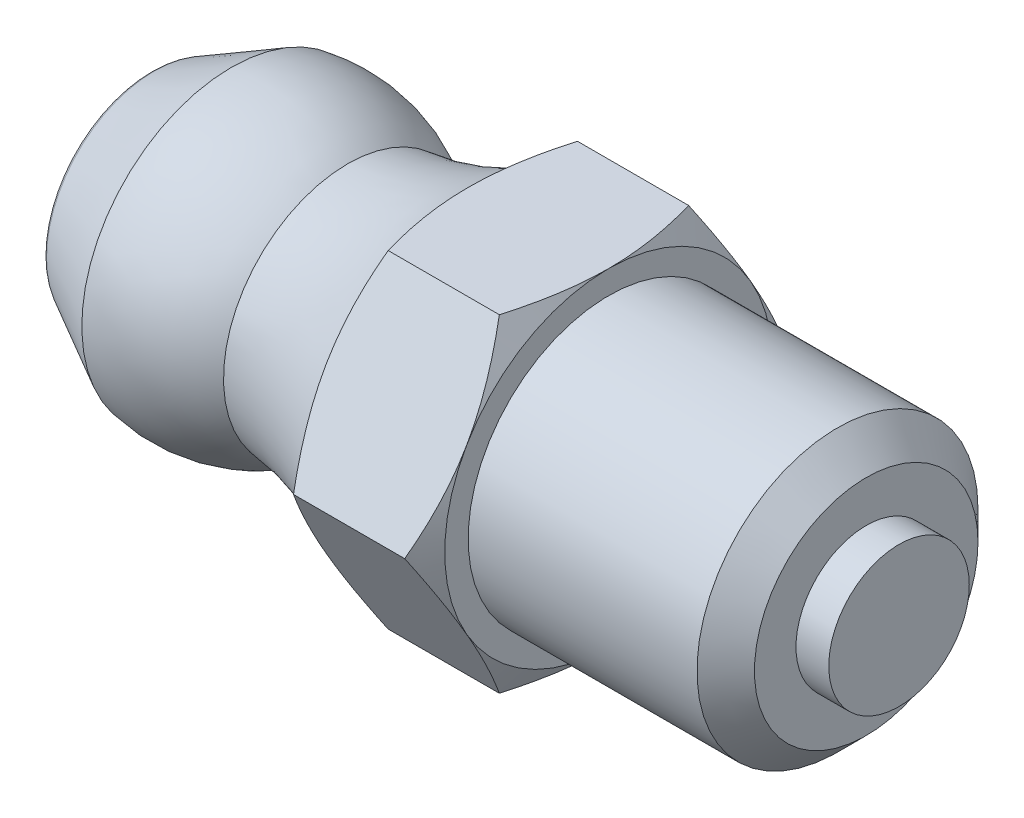
ISO-10303-21;
HEADER;
FILE_DESCRIPTION(('STEP AP214'),'2;1');
FILE_NAME('part.step','',(''),(''),'','','');
FILE_SCHEMA(('AUTOMOTIVE_DESIGN { 1 0 10303 214 1 1 1 1 }'));
ENDSEC;
DATA;
#1=APPLICATION_CONTEXT('core data for automotive mechanical design processes');
#2=APPLICATION_PROTOCOL_DEFINITION('international standard','automotive_design',2000,#1);
#3=PRODUCT_CONTEXT('',#1,'mechanical');
#4=PRODUCT('Part','Part','',(#3));
#5=PRODUCT_RELATED_PRODUCT_CATEGORY('part','',(#4));
#6=PRODUCT_DEFINITION_FORMATION('','',#4);
#7=PRODUCT_DEFINITION_CONTEXT('part definition',#1,'design');
#8=PRODUCT_DEFINITION('design','',#6,#7);
#9=PRODUCT_DEFINITION_SHAPE('','',#8);
#10=(LENGTH_UNIT() NAMED_UNIT(*) SI_UNIT(.MILLI.,.METRE.));
#11=(NAMED_UNIT(*) PLANE_ANGLE_UNIT() SI_UNIT($,.RADIAN.));
#12=(NAMED_UNIT(*) SI_UNIT($,.STERADIAN.) SOLID_ANGLE_UNIT());
#13=UNCERTAINTY_MEASURE_WITH_UNIT(LENGTH_MEASURE(1.E-05),#10,'distance_accuracy_value','');
#14=(GEOMETRIC_REPRESENTATION_CONTEXT(3) GLOBAL_UNCERTAINTY_ASSIGNED_CONTEXT((#13)) GLOBAL_UNIT_ASSIGNED_CONTEXT((#10,
#11,#12)) REPRESENTATION_CONTEXT('',''));
#15=CARTESIAN_POINT('',(0.,0.,0.));
#16=DIRECTION('',(0.,0.,1.));
#17=DIRECTION('',(1.,0.,0.));
#18=AXIS2_PLACEMENT_3D('',#15,#16,#17);
#19=CARTESIAN_POINT('',(-2.68551696456143,0.,0.));
#20=DIRECTION('',(1.,0.,0.));
#21=DIRECTION('',(0.,0.,-1.));
#22=AXIS2_PLACEMENT_3D('',#19,#20,#21);
#23=CONICAL_SURFACE('',#22,4.04470059544337,1.04719755120523);
#24=CARTESIAN_POINT('',(-2.6873926088047,9.33987770145344E-12,-4.04145188432874));
#25=CARTESIAN_POINT('',(-2.73528350417485,0.143657647443275,-3.95851110290731));
#26=CARTESIAN_POINT('',(-2.77912897165721,0.288451754037613,-3.87491418648621));
#27=CARTESIAN_POINT('',(-2.85662039631276,0.580392046978202,-3.70636237976833));
#28=CARTESIAN_POINT('',(-2.89024353270487,0.727542735051402,-3.6214048903983));
#29=CARTESIAN_POINT('',(-2.9443136056338,1.0201929490846,-3.45244321054822));
#30=CARTESIAN_POINT('',(-2.96504882119068,1.16565127222401,-3.36846280852777));
#31=CARTESIAN_POINT('',(-2.99288461839885,1.45740711983151,-3.20001749137364));
#32=CARTESIAN_POINT('',(-2.99999999996195,1.60370355991562,-3.11555320230935));
#33=CARTESIAN_POINT('',(-2.99999999996197,1.89629644008413,-2.94662462418112));
#34=CARTESIAN_POINT('',(-2.99288461839886,2.04259288016852,-2.86216033511718));
#35=CARTESIAN_POINT('',(-2.96504882119062,2.33434872777635,-2.69371501796334));
#36=CARTESIAN_POINT('',(-2.94431360563366,2.47980705091579,-2.60973461594284));
#37=CARTESIAN_POINT('',(-2.89024353270487,2.77245726494896,-2.44077293609234));
#38=CARTESIAN_POINT('',(-2.85662039631298,2.91960795302209,-2.35581544672189));
#39=CARTESIAN_POINT('',(-2.77912897165668,3.21154824596325,-2.18726364000504));
#40=CARTESIAN_POINT('',(-2.73528350417334,3.35634235255824,-2.10366672358537));
#41=CARTESIAN_POINT('',(-2.68739260880087,3.49999999999358,-2.02072594216739));
#42=B_SPLINE_CURVE_WITH_KNOTS('',3,(#24,#25,#26,#27,#28,#29,#30,#31,#32,#33,#34,#35,#36,#37,#38,
#39,#40,#41),.UNSPECIFIED.,.F.,.F.,(4,2,2,2,2,2,2,2,4),(0.,0.518128442797922,1.03740522553155,
1.5446040034222,2.05125132319115,2.55789864296032,3.06509742085119,3.58437420358504,
4.10250264638326),.UNSPECIFIED.);
#43=CARTESIAN_POINT('',(-2.99999999996214,1.75,-3.03108891324554));
#44=VERTEX_POINT('',#43);
#45=CARTESIAN_POINT('',(-2.68739260880116,3.49999999999635,-2.02072594216158));
#46=VERTEX_POINT('',#45);
#47=EDGE_CURVE('E179',#44,#46,#42,.T.);
#48=ORIENTED_EDGE('',*,*,#47,.F.);
#49=CARTESIAN_POINT('',(-2.9999999999859,0.,0.));
#50=DIRECTION('',(1.,0.,0.));
#51=DIRECTION('',(0.,0.,1.));
#52=AXIS2_PLACEMENT_3D('',#49,#50,#51);
#53=CIRCLE('',#52,3.49999999997408);
#54=CARTESIAN_POINT('',(-2.9999999999859,3.5,0.));
#55=VERTEX_POINT('',#54);
#56=EDGE_CURVE('E67',#44,#55,#53,.T.);
#57=ORIENTED_EDGE('',*,*,#56,.T.);
#58=CARTESIAN_POINT('',(-2.6873926088047,3.50000000000585,-2.02072594215628));
#59=CARTESIAN_POINT('',(-2.73528350417485,3.50000000000212,-1.85484437931987));
#60=CARTESIAN_POINT('',(-2.77912897165721,3.50000000000058,-1.68765054648035));
#61=CARTESIAN_POINT('',(-2.85662039631276,3.49999999999942,-1.35054693304659));
#62=CARTESIAN_POINT('',(-2.89024353270487,3.49999999999983,-1.18063195430582));
#63=CARTESIAN_POINT('',(-2.9443136056338,3.50000000000017,-0.842708594605082));
#64=CARTESIAN_POINT('',(-2.96504882119068,3.50000000000012,-0.674747790564246));
#65=CARTESIAN_POINT('',(-2.99288461839885,3.49999999999987,-0.337857156256419));
#66=CARTESIAN_POINT('',(-2.99999999996195,3.49999999999967,-0.168928578128211));
#67=CARTESIAN_POINT('',(-2.99999999996197,3.49999999999969,0.168928578128286));
#68=CARTESIAN_POINT('',(-2.99288461839886,3.49999999999992,0.337857156256575));
#69=CARTESIAN_POINT('',(-2.96504882119063,3.50000000000008,0.674747790564535));
#70=CARTESIAN_POINT('',(-2.94431360563366,3.50000000000002,0.842708594605422));
#71=CARTESIAN_POINT('',(-2.89024353270487,3.49999999999997,1.18063195430636));
#72=CARTESIAN_POINT('',(-2.85662039631299,3.49999999999999,1.35054693304726));
#73=CARTESIAN_POINT('',(-2.77912897165668,3.50000000000001,1.68765054648101));
#74=CARTESIAN_POINT('',(-2.73528350417335,3.50000000000002,1.85484437932038));
#75=CARTESIAN_POINT('',(-2.68739260880087,3.5,2.02072594215628));
#76=B_SPLINE_CURVE_WITH_KNOTS('',3,(#58,#59,#60,#61,#62,#63,#64,#65,#66,#67,#68,#69,#70,#71,#72,
#73,#74,#75),.UNSPECIFIED.,.F.,.F.,(4,2,2,2,2,2,2,2,4),(0.,0.518128442797922,1.03740522553155,
1.5446040034222,2.05125132319115,2.55789864296032,3.06509742085119,3.58437420358504,
4.10250264638326),.UNSPECIFIED.);
#77=EDGE_CURVE('E141',#46,#55,#76,.T.);
#78=ORIENTED_EDGE('',*,*,#77,.F.);
#79=EDGE_LOOP('',(#48,#57,#78));
#80=FACE_BOUND('',#79,.T.);
#81=ADVANCED_FACE('F52',(#80),#23,.T.);
#82=CARTESIAN_POINT('',(-2.68739260879995,3.49999999999635,2.0207259421658));
#83=VERTEX_POINT('',#82);
#84=EDGE_CURVE('E132',#55,#83,#76,.T.);
#85=ORIENTED_EDGE('',*,*,#84,.F.);
#86=CARTESIAN_POINT('',(-2.9999999999859,1.75,3.03108891324554));
#87=VERTEX_POINT('',#86);
#88=EDGE_CURVE('E150',#55,#87,#53,.T.);
#89=ORIENTED_EDGE('',*,*,#88,.T.);
#90=CARTESIAN_POINT('',(-2.6873926088047,3.49999999999651,2.02072594217246));
#91=CARTESIAN_POINT('',(-2.73528350417485,3.35634235255885,2.10366672358744));
#92=CARTESIAN_POINT('',(-2.77912897165721,3.21154824596296,2.18726364000586));
#93=CARTESIAN_POINT('',(-2.85662039631276,2.91960795302122,2.35581544672174));
#94=CARTESIAN_POINT('',(-2.89024353270487,2.77245726494843,2.44077293609247));
#95=CARTESIAN_POINT('',(-2.9443136056338,2.47980705091557,2.60973461594314));
#96=CARTESIAN_POINT('',(-2.96504882119068,2.33434872777612,2.69371501796352));
#97=CARTESIAN_POINT('',(-2.99288461839885,2.04259288016837,2.86216033511722));
#98=CARTESIAN_POINT('',(-2.99999999996195,1.89629644008405,2.94662462418114));
#99=CARTESIAN_POINT('',(-2.99999999996197,1.60370355991557,3.11555320230941));
#100=CARTESIAN_POINT('',(-2.99288461839887,1.4574071198314,3.20001749137375));
#101=CARTESIAN_POINT('',(-2.96504882119063,1.16565127222373,3.36846280852787));
#102=CARTESIAN_POINT('',(-2.94431360563366,1.02019294908423,3.45244321054826));
#103=CARTESIAN_POINT('',(-2.89024353270487,0.727542735051013,3.62140489039869));
#104=CARTESIAN_POINT('',(-2.85662039631299,0.580392046977899,3.70636237976915));
#105=CARTESIAN_POINT('',(-2.77912897165668,0.288451754036758,3.87491418648605));
#106=CARTESIAN_POINT('',(-2.73528350417335,0.143657647441784,3.95851110290574));
#107=CARTESIAN_POINT('',(-2.68739260880087,6.41288661933034E-12,4.04145188432367));
#108=B_SPLINE_CURVE_WITH_KNOTS('',3,(#90,#91,#92,#93,#94,#95,#96,#97,#98,#99,#100,#101,#102,
#103,#104,#105,#106,#107),.UNSPECIFIED.,.F.,.F.,(4,2,2,2,2,2,2,2,4),(0.,0.518128442797922,
1.03740522553154,1.5446040034222,2.05125132319114,2.55789864296031,3.06509742085119,
3.58437420358504,4.10250264638326),.UNSPECIFIED.);
#109=EDGE_CURVE('E148',#83,#87,#108,.T.);
#110=ORIENTED_EDGE('',*,*,#109,.F.);
#111=EDGE_LOOP('',(#85,#89,#110));
#112=FACE_BOUND('',#111,.T.);
#113=ADVANCED_FACE('F149',(#112),#23,.T.);
#114=CARTESIAN_POINT('',(-2.68739260880116,0.,4.04145188432316));
#115=VERTEX_POINT('',#114);
#116=EDGE_CURVE('E155',#87,#115,#108,.T.);
#117=ORIENTED_EDGE('',*,*,#116,.F.);
#118=CARTESIAN_POINT('',(-2.9999999999859,-1.75,3.03108891324554));
#119=VERTEX_POINT('',#118);
#120=EDGE_CURVE('E574',#87,#119,#53,.T.);
#121=ORIENTED_EDGE('',*,*,#120,.T.);
#122=CARTESIAN_POINT('',(-2.6873926088047,-9.34046040191118E-12,4.04145188432874));
#123=CARTESIAN_POINT('',(-2.73528350417485,-0.143657647443276,3.95851110290731));
#124=CARTESIAN_POINT('',(-2.77912897165721,-0.288451754037614,3.87491418648621));
#125=CARTESIAN_POINT('',(-2.85662039631276,-0.580392046978203,3.70636237976833));
#126=CARTESIAN_POINT('',(-2.89024353270487,-0.727542735051402,3.6214048903983));
#127=CARTESIAN_POINT('',(-2.9443136056338,-1.02019294908461,3.45244321054822));
#128=CARTESIAN_POINT('',(-2.96504882119068,-1.16565127222401,3.36846280852777));
#129=CARTESIAN_POINT('',(-2.99288461839884,-1.45740711983151,3.20001749137364));
#130=CARTESIAN_POINT('',(-2.99999999996195,-1.60370355991562,3.11555320230936));
#131=CARTESIAN_POINT('',(-2.99999999996197,-1.89629644008413,2.94662462418112));
#132=CARTESIAN_POINT('',(-2.99288461839886,-2.04259288016852,2.86216033511718));
#133=CARTESIAN_POINT('',(-2.96504882119062,-2.33434872777635,2.69371501796334));
#134=CARTESIAN_POINT('',(-2.94431360563366,-2.47980705091579,2.60973461594284));
#135=CARTESIAN_POINT('',(-2.89024353270487,-2.77245726494896,2.44077293609234));
#136=CARTESIAN_POINT('',(-2.85662039631298,-2.91960795302209,2.35581544672189));
#137=CARTESIAN_POINT('',(-2.77912897165668,-3.21154824596325,2.18726364000504));
#138=CARTESIAN_POINT('',(-2.73528350417334,-3.35634235255824,2.10366672358537));
#139=CARTESIAN_POINT('',(-2.68739260880087,-3.49999999999359,2.0207259421674));
#140=B_SPLINE_CURVE_WITH_KNOTS('',3,(#122,#123,#124,#125,#126,#127,#128,#129,#130,#131,#132,
#133,#134,#135,#136,#137,#138,#139),.UNSPECIFIED.,.F.,.F.,(4,2,2,2,2,2,2,2,4),(0.,
0.518128442797922,1.03740522553155,1.5446040034222,2.05125132319115,2.55789864296032,
3.06509742085119,3.58437420358504,4.10250264638325),.UNSPECIFIED.);
#141=EDGE_CURVE('E192',#115,#119,#140,.T.);
#142=ORIENTED_EDGE('',*,*,#141,.F.);
#143=EDGE_LOOP('',(#117,#121,#142));
#144=FACE_BOUND('',#143,.T.);
#145=ADVANCED_FACE('F602',(#144),#23,.T.);
#146=CARTESIAN_POINT('',(-2.68739260880116,-3.49999999999635,2.02072594216158));
#147=VERTEX_POINT('',#146);
#148=EDGE_CURVE('E196',#119,#147,#140,.T.);
#149=ORIENTED_EDGE('',*,*,#148,.F.);
#150=CARTESIAN_POINT('',(-2.9999999999859,-3.5,0.));
#151=VERTEX_POINT('',#150);
#152=EDGE_CURVE('E575',#119,#151,#53,.T.);
#153=ORIENTED_EDGE('',*,*,#152,.T.);
#154=CARTESIAN_POINT('',(-2.6873926088047,-3.50000000000585,2.02072594215628));
#155=CARTESIAN_POINT('',(-2.73528350417485,-3.50000000000212,1.85484437931987));
#156=CARTESIAN_POINT('',(-2.77912897165721,-3.50000000000058,1.68765054648035));
#157=CARTESIAN_POINT('',(-2.85662039631276,-3.49999999999942,1.35054693304659));
#158=CARTESIAN_POINT('',(-2.89024353270487,-3.49999999999983,1.18063195430582));
#159=CARTESIAN_POINT('',(-2.9443136056338,-3.50000000000017,0.842708594605082));
#160=CARTESIAN_POINT('',(-2.96504882119068,-3.50000000000013,0.674747790564246));
#161=CARTESIAN_POINT('',(-2.99288461839885,-3.49999999999987,0.337857156256419));
#162=CARTESIAN_POINT('',(-2.99999999996195,-3.49999999999967,0.168928578128211));
#163=CARTESIAN_POINT('',(-2.99999999996197,-3.49999999999969,-0.168928578128286));
#164=CARTESIAN_POINT('',(-2.99288461839886,-3.49999999999992,-0.337857156256575));
#165=CARTESIAN_POINT('',(-2.96504882119063,-3.50000000000008,-0.674747790564535));
#166=CARTESIAN_POINT('',(-2.94431360563366,-3.50000000000002,-0.842708594605422));
#167=CARTESIAN_POINT('',(-2.89024353270487,-3.49999999999998,-1.18063195430636));
#168=CARTESIAN_POINT('',(-2.85662039631299,-3.49999999999999,-1.35054693304726));
#169=CARTESIAN_POINT('',(-2.77912897165668,-3.50000000000001,-1.68765054648101));
#170=CARTESIAN_POINT('',(-2.73528350417335,-3.50000000000002,-1.85484437932038));
#171=CARTESIAN_POINT('',(-2.68739260880087,-3.5,-2.02072594215628));
#172=B_SPLINE_CURVE_WITH_KNOTS('',3,(#154,#155,#156,#157,#158,#159,#160,#161,#162,#163,#164,
#165,#166,#167,#168,#169,#170,#171),.UNSPECIFIED.,.F.,.F.,(4,2,2,2,2,2,2,2,4),(0.,
0.518128442797922,1.03740522553155,1.5446040034222,2.05125132319115,2.55789864296032,
3.06509742085119,3.58437420358504,4.10250264638326),.UNSPECIFIED.);
#173=EDGE_CURVE('E186',#147,#151,#172,.T.);
#174=ORIENTED_EDGE('',*,*,#173,.F.);
#175=EDGE_LOOP('',(#149,#153,#174));
#176=FACE_BOUND('',#175,.T.);
#177=ADVANCED_FACE('F934',(#176),#23,.T.);
#178=CARTESIAN_POINT('',(-2.68739260880116,-3.49999999999635,-2.02072594216158));
#179=VERTEX_POINT('',#178);
#180=EDGE_CURVE('E191',#151,#179,#172,.T.);
#181=ORIENTED_EDGE('',*,*,#180,.F.);
#182=CARTESIAN_POINT('',(-2.9999999999859,-1.75,-3.03108891324554));
#183=VERTEX_POINT('',#182);
#184=EDGE_CURVE('E572',#151,#183,#53,.T.);
#185=ORIENTED_EDGE('',*,*,#184,.T.);
#186=CARTESIAN_POINT('',(-2.6873926088047,-3.49999999999651,-2.02072594217246));
#187=CARTESIAN_POINT('',(-2.73528350417485,-3.35634235255885,-2.10366672358744));
#188=CARTESIAN_POINT('',(-2.77912897165721,-3.21154824596296,-2.18726364000586));
#189=CARTESIAN_POINT('',(-2.85662039631276,-2.91960795302122,-2.35581544672174));
#190=CARTESIAN_POINT('',(-2.89024353270487,-2.77245726494843,-2.44077293609247));
#191=CARTESIAN_POINT('',(-2.9443136056338,-2.47980705091557,-2.60973461594314));
#192=CARTESIAN_POINT('',(-2.96504882119068,-2.33434872777612,-2.69371501796352));
#193=CARTESIAN_POINT('',(-2.99288461839885,-2.04259288016837,-2.86216033511722));
#194=CARTESIAN_POINT('',(-2.99999999996195,-1.89629644008405,-2.94662462418114));
#195=CARTESIAN_POINT('',(-2.99999999996197,-1.60370355991557,-3.11555320230941));
#196=CARTESIAN_POINT('',(-2.99288461839887,-1.4574071198314,-3.20001749137375));
#197=CARTESIAN_POINT('',(-2.96504882119063,-1.16565127222373,-3.36846280852787));
#198=CARTESIAN_POINT('',(-2.94431360563366,-1.02019294908424,-3.45244321054827));
#199=CARTESIAN_POINT('',(-2.89024353270487,-0.727542735051016,-3.62140489039869));
#200=CARTESIAN_POINT('',(-2.85662039631299,-0.580392046977902,-3.70636237976916));
#201=CARTESIAN_POINT('',(-2.77912897165668,-0.288451754036761,-3.87491418648605));
#202=CARTESIAN_POINT('',(-2.73528350417335,-0.143657647441786,-3.95851110290574));
#203=CARTESIAN_POINT('',(-2.68739260880087,-6.41557547052514E-12,-4.04145188432368));
#204=B_SPLINE_CURVE_WITH_KNOTS('',3,(#186,#187,#188,#189,#190,#191,#192,#193,#194,#195,#196,
#197,#198,#199,#200,#201,#202,#203),.UNSPECIFIED.,.F.,.F.,(4,2,2,2,2,2,2,2,4),(0.,
0.518128442797922,1.03740522553154,1.5446040034222,2.05125132319114,2.55789864296031,
3.06509742085118,3.58437420358504,4.10250264638326),.UNSPECIFIED.);
#205=EDGE_CURVE('E180',#179,#183,#204,.T.);
#206=ORIENTED_EDGE('',*,*,#205,.F.);
#207=EDGE_LOOP('',(#181,#185,#206));
#208=FACE_BOUND('',#207,.T.);
#209=ADVANCED_FACE('F929',(#208),#23,.T.);
#210=CARTESIAN_POINT('',(-2.68739260880116,0.,-4.04145188432317));
#211=VERTEX_POINT('',#210);
#212=EDGE_CURVE('E185',#183,#211,#204,.T.);
#213=ORIENTED_EDGE('',*,*,#212,.F.);
#214=EDGE_CURVE('E566',#183,#44,#53,.T.);
#215=ORIENTED_EDGE('',*,*,#214,.T.);
#216=EDGE_CURVE('E174',#211,#44,#42,.T.);
#217=ORIENTED_EDGE('',*,*,#216,.F.);
#218=EDGE_LOOP('',(#213,#215,#217));
#219=FACE_BOUND('',#218,.T.);
#220=ADVANCED_FACE('F287',(#219),#23,.T.);
#221=CARTESIAN_POINT('',(0.,3.5,2.02072594216369));
#222=DIRECTION('',(0.,0.499999999999999,0.866025403784439));
#223=DIRECTION('',(0.,-0.866025403784439,0.499999999999999));
#224=AXIS2_PLACEMENT_3D('',#221,#222,#223);
#225=PLANE('',#224);
#226=ORIENTED_EDGE('',*,*,#109,.T.);
#227=ORIENTED_EDGE('',*,*,#116,.T.);
#228=DIRECTION('',(1.,0.,0.));
#229=VECTOR('',#228,1.);
#230=CARTESIAN_POINT('',(0.,0.,4.04145188432738));
#231=LINE('',#230,#229);
#232=CARTESIAN_POINT('',(-0.312607387336259,-1.15527417577148E-08,4.0414518776574));
#233=VERTEX_POINT('',#232);
#234=EDGE_CURVE('E154',#233,#115,#231,.F.);
#235=ORIENTED_EDGE('',*,*,#234,.F.);
#236=CARTESIAN_POINT('',(-2.48040500880689E-11,1.74999999999909,3.03108891324396));
#237=CARTESIAN_POINT('',(1.43043445852747E-05,1.67572231848429,3.07397315266266));
#238=CARTESIAN_POINT('',(-0.00181985329636482,1.6014482151767,3.11685532620166));
#239=CARTESIAN_POINT('',(-0.00907877522698662,1.45304584681262,3.20253547352544));
#240=CARTESIAN_POINT('',(-0.0145028286899612,1.37891755579802,3.24533346229714));
#241=CARTESIAN_POINT('',(-0.0287995077491232,1.23128562194053,3.33056879905065));
#242=CARTESIAN_POINT('',(-0.0376547724623487,1.15778070848058,3.37300688062354));
#243=CARTESIAN_POINT('',(-0.0586233938951768,1.01112108438706,3.45768085407322));
#244=CARTESIAN_POINT('',(-0.0707368363724875,0.937966383022924,3.49991674059828));
#245=CARTESIAN_POINT('',(-0.111590214343689,0.719330829378494,3.62614603634929));
#246=CARTESIAN_POINT('',(-0.144863037628532,0.574485121557862,3.7097727447505));
#247=CARTESIAN_POINT('',(-0.221598678512486,0.286039315376671,3.87630700859584));
#248=CARTESIAN_POINT('',(-0.265112386702069,0.142449278265546,3.95920875517491));
#249=CARTESIAN_POINT('',(-0.312607382540224,2.59408366574694E-08,4.04145186935043));
#250=B_SPLINE_CURVE_WITH_KNOTS('',3,(#236,#237,#238,#239,#240,#241,#242,#243,#244,#245,#246,
#247,#248,#249),.UNSPECIFIED.,.F.,.F.,(4,2,2,2,2,2,4),(0.,0.257279178018007,0.514507428035292,
0.770450827725367,1.02640096469903,1.53763039879076,2.05145605184419),.UNSPECIFIED.);
#251=CARTESIAN_POINT('',(-1.62757714794551E-11,1.74999999999352,3.03108891323431));
#252=VERTEX_POINT('',#251);
#253=EDGE_CURVE('E436',#252,#233,#250,.T.);
#254=ORIENTED_EDGE('',*,*,#253,.F.);
#255=CARTESIAN_POINT('',(-0.312607366176726,3.49999992494532,2.02072598548559));
#256=CARTESIAN_POINT('',(-0.26511237261932,3.35755067649427,2.10296909743178));
#257=CARTESIAN_POINT('',(-0.221598666606615,3.21396064331575,2.18587084174317));
#258=CARTESIAN_POINT('',(-0.144863029660622,2.92551484507414,2.35240510100657));
#259=CARTESIAN_POINT('',(-0.111590208140904,2.78066914125945,2.43603180709413));
#260=CARTESIAN_POINT('',(-0.0707368323878583,2.56203359373064,2.56226109931404));
#261=CARTESIAN_POINT('',(-0.0586233905790608,2.48887889442832,2.60449698464879));
#262=CARTESIAN_POINT('',(-0.0376547703141622,2.34221927448591,2.68917095570183));
#263=CARTESIAN_POINT('',(-0.0287995061003714,2.26871436311527,2.73160903606841));
#264=CARTESIAN_POINT('',(-0.0145028278541159,2.1210824334828,2.81684437038269));
#265=CARTESIAN_POINT('',(-0.0090787747029709,2.04695414460406,2.8596423579214));
#266=CARTESIAN_POINT('',(-0.00181985319095702,1.89855178052473,2.94532250277098));
#267=CARTESIAN_POINT('',(1.43043433355906E-05,1.82427767936603,2.98820467506878));
#268=CARTESIAN_POINT('',(-2.37577333818732E-11,1.75000000000026,3.03108891324538));
#269=B_SPLINE_CURVE_WITH_KNOTS('',3,(#255,#256,#257,#258,#259,#260,#261,#262,#263,#264,#265,
#266,#267,#268),.UNSPECIFIED.,.F.,.F.,(4,2,2,2,2,2,4),(0.,0.513825638250401,1.02505505771805,
1.28100518734159,1.53694857968282,1.79417682226348,2.05145599283765),.UNSPECIFIED.);
#270=CARTESIAN_POINT('',(-0.312607378679086,3.49999996247574,2.02072596382833));
#271=VERTEX_POINT('',#270);
#272=EDGE_CURVE('E159',#271,#252,#269,.T.);
#273=ORIENTED_EDGE('',*,*,#272,.F.);
#274=DIRECTION('',(1.,0.,0.));
#275=VECTOR('',#274,1.);
#276=CARTESIAN_POINT('',(0.,3.5,2.02072594216369));
#277=LINE('',#276,#275);
#278=EDGE_CURVE('E136',#83,#271,#277,.T.);
#279=ORIENTED_EDGE('',*,*,#278,.F.);
#280=EDGE_LOOP('',(#226,#227,#235,#254,#273,#279));
#281=FACE_BOUND('',#280,.T.);
#282=ADVANCED_FACE('F157',(#281),#225,.T.);
#283=CARTESIAN_POINT('',(0.,0.,4.04145188432738));
#284=DIRECTION('',(0.,-0.5,0.866025403784439));
#285=DIRECTION('',(0.,-0.866025403784439,-0.5));
#286=AXIS2_PLACEMENT_3D('',#283,#284,#285);
#287=PLANE('',#286);
#288=ORIENTED_EDGE('',*,*,#141,.T.);
#289=ORIENTED_EDGE('',*,*,#148,.T.);
#290=DIRECTION('',(1.,0.,0.));
#291=VECTOR('',#290,1.);
#292=CARTESIAN_POINT('',(0.,-3.5,2.02072594216369));
#293=LINE('',#292,#291);
#294=CARTESIAN_POINT('',(-0.312607378681213,-3.5,2.02072589884178));
#295=VERTEX_POINT('',#294);
#296=EDGE_CURVE('E187',#295,#147,#293,.F.);
#297=ORIENTED_EDGE('',*,*,#296,.F.);
#298=CARTESIAN_POINT('',(-2.48065852439542E-11,-1.7499999999991,3.03108891324396));
#299=CARTESIAN_POINT('',(1.43043462081673E-05,-1.82427768366418,2.98820467258649));
#300=CARTESIAN_POINT('',(-0.00181985340165598,-1.89855178912087,2.9453224978078));
#301=CARTESIAN_POINT('',(-0.00907877575100303,-2.04695416176922,2.8596423480113));
#302=CARTESIAN_POINT('',(-0.0145028295256677,-2.121082454919,2.81684435800656));
#303=CARTESIAN_POINT('',(-0.0287995093974927,-2.26871439300038,2.73160901881418));
#304=CARTESIAN_POINT('',(-0.0376547746100477,-2.34221930854919,2.68917093603535));
#305=CARTESIAN_POINT('',(-0.0586233972105754,-2.48887893679283,2.60449696018967));
#306=CARTESIAN_POINT('',(-0.0707368403562748,-2.56203364021823,2.56226107247452));
#307=CARTESIAN_POINT('',(-0.111590220544981,-2.78066919997703,2.43603177319333));
#308=CARTESIAN_POINT('',(-0.144863045594136,-2.9255149118032,2.35240506247953));
#309=CARTESIAN_POINT('',(-0.221598690416251,-3.21396072592121,2.18587079405189));
#310=CARTESIAN_POINT('',(-0.265112400783739,-3.35755076696257,2.10296904520372));
#311=CARTESIAN_POINT('',(-0.312607398905907,-3.5000000231562,2.02072592879445));
#312=B_SPLINE_CURVE_WITH_KNOTS('',3,(#298,#299,#300,#301,#302,#303,#304,#305,#306,#307,#308,
#309,#310,#311),.UNSPECIFIED.,.F.,.F.,(4,2,2,2,2,2,4),(0.,0.257279185460139,0.514507442912315,
0.770450849949458,1.02640099427149,1.53763044298412,2.0514561108375),.UNSPECIFIED.);
#313=CARTESIAN_POINT('',(-1.62767191660332E-11,-1.74999999999352,3.03108891323431));
#314=VERTEX_POINT('',#313);
#315=EDGE_CURVE('E408',#314,#295,#312,.T.);
#316=ORIENTED_EDGE('',*,*,#315,.F.);
#317=CARTESIAN_POINT('',(-0.31260739482678,-1.65575027726033E-08,4.04145185309801));
#318=CARTESIAN_POINT('',(-0.265112391391533,-0.142449273637957,3.95920875027724));
#319=CARTESIAN_POINT('',(-0.221598680104875,-0.286039312837389,3.87630700808347));
#320=CARTESIAN_POINT('',(-0.14486303690902,-0.574485120833971,3.70977274713688));
#321=CARTESIAN_POINT('',(-0.111590214383212,-0.719330828391745,3.62614603727973));
#322=CARTESIAN_POINT('',(-0.0707368366066242,-0.937966382157955,3.49991674091707));
#323=CARTESIAN_POINT('',(-0.0586233940404556,-1.01112108361023,3.45768085447308));
#324=CARTESIAN_POINT('',(-0.0376547725233544,-1.15778070781466,3.37300688105666));
#325=CARTESIAN_POINT('',(-0.0287995078140993,-1.23128562129732,3.33056879943598));
#326=CARTESIAN_POINT('',(-0.014502828738401,-1.37891755527015,3.24533346258786));
#327=CARTESIAN_POINT('',(-0.00907877525747234,-1.45304584637766,3.20253547376938));
#328=CARTESIAN_POINT('',(-0.00181985329816635,-1.60144821495092,3.11685532633922));
#329=CARTESIAN_POINT('',(1.43043524203502E-05,-1.67572231837484,3.0739731527406));
#330=CARTESIAN_POINT('',(-2.37598165443542E-11,-1.74999999999974,3.03108891324569));
#331=B_SPLINE_CURVE_WITH_KNOTS('',3,(#317,#318,#319,#320,#321,#322,#323,#324,#325,#326,#327,
#328,#329,#330),.UNSPECIFIED.,.F.,.F.,(4,2,2,2,2,2,4),(0.,0.513825654277039,1.02505508924192,
1.28100522638381,1.53694862619402,1.79417687652753,2.05145605494004),.UNSPECIFIED.);
#332=EDGE_CURVE('E530',#233,#314,#331,.T.);
#333=ORIENTED_EDGE('',*,*,#332,.F.);
#334=ORIENTED_EDGE('',*,*,#234,.T.);
#335=EDGE_LOOP('',(#288,#289,#297,#316,#333,#334));
#336=FACE_BOUND('',#335,.T.);
#337=ADVANCED_FACE('F420',(#336),#287,.T.);
#338=CARTESIAN_POINT('',(0.,-3.5,2.02072594216369));
#339=DIRECTION('',(0.,-1.,0.));
#340=DIRECTION('',(0.,0.,-1.));
#341=AXIS2_PLACEMENT_3D('',#338,#339,#340);
#342=PLANE('',#341);
#343=DIRECTION('',(1.,0.,0.));
#344=VECTOR('',#343,1.);
#345=CARTESIAN_POINT('',(0.,-3.5,-2.02072594216369));
#346=LINE('',#345,#344);
#347=CARTESIAN_POINT('',(-0.312607395993472,-3.5000000144189,-2.02072593383894));
#348=VERTEX_POINT('',#347);
#349=EDGE_CURVE('E181',#348,#179,#346,.F.);
#350=ORIENTED_EDGE('',*,*,#349,.F.);
#351=CARTESIAN_POINT('',(-2.4805124243007E-11,-3.49999999999819,0.));
#352=CARTESIAN_POINT('',(1.43043429588024E-05,-3.49999999999935,-0.0857684763531676));
#353=CARTESIAN_POINT('',(-0.00181985319105063,-3.49999999999983,-0.171532820948719));
#354=CARTESIAN_POINT('',(-0.00907877470284295,-3.50000000000017,-0.342893110647784));
#355=CARTESIAN_POINT('',(-0.0145028278540498,-3.50000000000005,-0.42848908572515));
#356=CARTESIAN_POINT('',(-0.0287995061003455,-3.49999999999995,-0.598959754353664));
#357=CARTESIAN_POINT('',(-0.0376547703141162,-3.49999999999999,-0.683835915086832));
#358=CARTESIAN_POINT('',(-0.0586233905789525,-3.50000000000001,-0.85318385719281));
#359=CARTESIAN_POINT('',(-0.0707368323877077,-3.5,-0.937655627862196));
#360=CARTESIAN_POINT('',(-0.111590208140849,-3.49999999999999,-1.1901142123022));
#361=CARTESIAN_POINT('',(-0.144863029660939,-3.49999999999999,-1.35736762447826));
#362=CARTESIAN_POINT('',(-0.221598666605744,-3.5,-1.69043614300199));
#363=CARTESIAN_POINT('',(-0.265112372616877,-3.50000000000001,-1.85623963162073));
#364=CARTESIAN_POINT('',(-0.312607366170447,-3.5,-2.02072585550321));
#365=B_SPLINE_CURVE_WITH_KNOTS('',3,(#351,#352,#353,#354,#355,#356,#357,#358,#359,#360,#361,
#362,#363,#364),.UNSPECIFIED.,.F.,.F.,(4,2,2,2,2,2,4),(0.,0.257279170574011,0.514507413154541,
0.770450805495705,1.02640093511917,1.53763035458632,2.05145599283609),.UNSPECIFIED.);
#366=CARTESIAN_POINT('',(-1.6276308382101E-11,-3.49999999998704,0.));
#367=VERTEX_POINT('',#366);
#368=EDGE_CURVE('E399',#367,#348,#365,.T.);
#369=ORIENTED_EDGE('',*,*,#368,.F.);
#370=CARTESIAN_POINT('',(-0.312607366183763,-3.49999999998592,2.02072585551741));
#371=CARTESIAN_POINT('',(-0.265112372623932,-3.49999999999508,1.85623963163499));
#372=CARTESIAN_POINT('',(-0.221598666609931,-3.49999999999871,1.69043614301542));
#373=CARTESIAN_POINT('',(-0.144863029662403,-3.50000000000128,1.35736762448932));
#374=CARTESIAN_POINT('',(-0.111590208142438,-3.50000000000023,1.19011421231173));
#375=CARTESIAN_POINT('',(-0.0707368323888953,-3.49999999999988,0.937655627869675));
#376=CARTESIAN_POINT('',(-0.0586233905799116,-3.49999999999997,0.853183857199679));
#377=CARTESIAN_POINT('',(-0.0376547703147055,-3.50000000000003,0.683835915092466));
#378=CARTESIAN_POINT('',(-0.0287995061007929,-3.50000000000001,0.598959754358674));
#379=CARTESIAN_POINT('',(-0.0145028278543339,-3.49999999999999,0.428489085728858));
#380=CARTESIAN_POINT('',(-0.00907877470310809,-3.5,0.342893110650815));
#381=CARTESIAN_POINT('',(-0.0018198531909846,-3.5,0.171532820950387));
#382=CARTESIAN_POINT('',(1.43043433365118E-05,-3.50000000000001,0.0857684763541485));
#383=CARTESIAN_POINT('',(-2.37588697836066E-11,-3.5,3.01409456298934E-13));
#384=B_SPLINE_CURVE_WITH_KNOTS('',3,(#370,#371,#372,#373,#374,#375,#376,#377,#378,#379,#380,
#381,#382,#383),.UNSPECIFIED.,.F.,.F.,(4,2,2,2,2,2,4),(0.,0.513825638254339,1.0250550577258,
1.28100518735119,1.53694857969425,1.79417682227682,2.05145599285291),.UNSPECIFIED.);
#385=EDGE_CURVE('E427',#295,#367,#384,.T.);
#386=ORIENTED_EDGE('',*,*,#385,.F.);
#387=ORIENTED_EDGE('',*,*,#296,.T.);
#388=ORIENTED_EDGE('',*,*,#173,.T.);
#389=ORIENTED_EDGE('',*,*,#180,.T.);
#390=EDGE_LOOP('',(#350,#369,#386,#387,#388,#389));
#391=FACE_BOUND('',#390,.T.);
#392=ADVANCED_FACE('F416',(#391),#342,.T.);
#393=CARTESIAN_POINT('',(0.,-3.5,-2.02072594216369));
#394=DIRECTION('',(0.,-0.5,-0.866025403784439));
#395=DIRECTION('',(0.,0.866025403784439,-0.5));
#396=AXIS2_PLACEMENT_3D('',#393,#394,#395);
#397=PLANE('',#396);
#398=DIRECTION('',(1.,0.,0.));
#399=VECTOR('',#398,1.);
#400=CARTESIAN_POINT('',(0.,0.,-4.04145188432738));
#401=LINE('',#400,#399);
#402=CARTESIAN_POINT('',(-0.312607395993333,-1.44184814394115E-08,-4.04145189265189));
#403=VERTEX_POINT('',#402);
#404=EDGE_CURVE('E175',#403,#211,#401,.F.);
#405=ORIENTED_EDGE('',*,*,#404,.F.);
#406=CARTESIAN_POINT('',(-2.48055654686809E-11,-1.7499999999991,-3.03108891324396));
#407=CARTESIAN_POINT('',(1.43043429589046E-05,-1.67572232063391,-3.07397315142157));
#408=CARTESIAN_POINT('',(-0.00181985319105209,-1.60144821947545,-3.11685532371978));
#409=CARTESIAN_POINT('',(-0.00907877470285105,-1.4530458553963,-3.20253546856966));
#410=CARTESIAN_POINT('',(-0.014502827854063,-1.37891756651751,-3.24533345610825));
#411=CARTESIAN_POINT('',(-0.0287995061003716,-1.23128563688498,-3.33056879042246));
#412=CARTESIAN_POINT('',(-0.0376547703141502,-1.15778072551435,-3.3730068707891));
#413=CARTESIAN_POINT('',(-0.0586233905790051,-1.0111211055719,-3.45768084184215));
#414=CARTESIAN_POINT('',(-0.0707368323877711,-0.937966406269521,-3.49991672717685));
#415=CARTESIAN_POINT('',(-0.111590208140949,-0.719330858740917,-3.6261460193969));
#416=CARTESIAN_POINT('',(-0.144863029661066,-0.574485154926756,-3.70977272548497));
#417=CARTESIAN_POINT('',(-0.221598666605934,-0.286039356684232,-3.87630698474692));
#418=CARTESIAN_POINT('',(-0.265112372617102,-0.142449323504264,-3.95920872905632));
#419=CARTESIAN_POINT('',(-0.312607366170709,-7.50493904001334E-08,-4.04145184099759));
#420=B_SPLINE_CURVE_WITH_KNOTS('',3,(#406,#407,#408,#409,#410,#411,#412,#413,#414,#415,#416,
#417,#418,#419),.UNSPECIFIED.,.F.,.F.,(4,2,2,2,2,2,4),(0.,0.25727917057413,0.51450741315478,
0.770450805496062,1.02640093511964,1.53763035458703,2.05145599283704),.UNSPECIFIED.);
#421=CARTESIAN_POINT('',(-1.62764229015695E-11,-1.74999999999352,-3.03108891323431));
#422=VERTEX_POINT('',#421);
#423=EDGE_CURVE('E372',#422,#403,#420,.T.);
#424=ORIENTED_EDGE('',*,*,#423,.F.);
#425=CARTESIAN_POINT('',(-0.312607423476969,-3.50000000440651,-2.02072589629064));
#426=CARTESIAN_POINT('',(-0.265112410163834,-3.35755076311944,-2.10296903228753));
#427=CARTESIAN_POINT('',(-0.221598693603198,-3.21396072758294,-2.18587078913662));
#428=CARTESIAN_POINT('',(-0.144863044157451,-2.92551491666751,-2.352405063607));
#429=CARTESIAN_POINT('',(-0.111590220625548,-2.78066920258199,-2.43603177241063));
#430=CARTESIAN_POINT('',(-0.0707368408254085,-2.56203364164076,-2.56226107129211));
#431=CARTESIAN_POINT('',(-0.0586233975018656,-2.4888789382671,-2.60449695924124));
#432=CARTESIAN_POINT('',(-0.037654774732556,-2.34221930996908,-2.68917093531282));
#433=CARTESIAN_POINT('',(-0.0287995095278342,-2.26871439431429,-2.73160901808349));
#434=CARTESIAN_POINT('',(-0.0145028296226885,-2.12108245595272,-2.8168443573817));
#435=CARTESIAN_POINT('',(-0.00907877581197416,-2.04695416262856,-2.85964234750096));
#436=CARTESIAN_POINT('',(-0.00181985340537327,-1.89855178958558,-2.94532249755369));
#437=CARTESIAN_POINT('',(1.43043615082946E-05,-1.82427768390856,-2.98820467247414));
#438=CARTESIAN_POINT('',(-2.37589802652052E-11,-1.75000000000026,-3.03108891324538));
#439=B_SPLINE_CURVE_WITH_KNOTS('',3,(#425,#426,#427,#428,#429,#430,#431,#432,#433,#434,#435,
#436,#437,#438),.UNSPECIFIED.,.F.,.F.,(4,2,2,2,2,2,4),(0.,0.513825670303747,1.02505512076594,
1.2810052654262,1.53694867270542,1.79417693079182,2.05145611704272),.UNSPECIFIED.);
#440=EDGE_CURVE('E392',#348,#422,#439,.T.);
#441=ORIENTED_EDGE('',*,*,#440,.F.);
#442=ORIENTED_EDGE('',*,*,#349,.T.);
#443=ORIENTED_EDGE('',*,*,#205,.T.);
#444=ORIENTED_EDGE('',*,*,#212,.T.);
#445=EDGE_LOOP('',(#405,#424,#441,#442,#443,#444));
#446=FACE_BOUND('',#445,.T.);
#447=ADVANCED_FACE('F419',(#446),#397,.T.);
#448=CARTESIAN_POINT('',(0.,0.,-4.04145188432738));
#449=DIRECTION('',(0.,0.5,-0.866025403784439));
#450=DIRECTION('',(0.,0.866025403784439,0.5));
#451=AXIS2_PLACEMENT_3D('',#448,#449,#450);
#452=PLANE('',#451);
#453=DIRECTION('',(1.,0.,0.));
#454=VECTOR('',#453,1.);
#455=CARTESIAN_POINT('',(0.,3.5,-2.02072594216369));
#456=LINE('',#455,#454);
#457=CARTESIAN_POINT('',(-0.312607395993333,3.5,-2.02072595881272));
#458=VERTEX_POINT('',#457);
#459=EDGE_CURVE('E145',#458,#46,#456,.F.);
#460=ORIENTED_EDGE('',*,*,#459,.F.);
#461=CARTESIAN_POINT('',(-2.48060557572976E-11,1.7499999999991,-3.03108891324396));
#462=CARTESIAN_POINT('',(1.43043429583714E-05,1.82427767936544,-2.98820467506837));
#463=CARTESIAN_POINT('',(-0.00181985319105274,1.89855178052438,-2.94532250277098));
#464=CARTESIAN_POINT('',(-0.00907877470285193,2.04695414460388,-2.85964235792171));
#465=CARTESIAN_POINT('',(-0.014502827854064,2.12108243348254,-2.8168443703829));
#466=CARTESIAN_POINT('',(-0.0287995061003727,2.26871436311498,-2.73160903606852));
#467=CARTESIAN_POINT('',(-0.0376547703141512,2.34221927448564,-2.68917095570195));
#468=CARTESIAN_POINT('',(-0.0586233905790059,2.48887889442811,-2.60449698464895));
#469=CARTESIAN_POINT('',(-0.0707368323877718,2.56203359373049,-2.56226109931423));
#470=CARTESIAN_POINT('',(-0.111590208140949,2.78066914125907,-2.43603180709416));
#471=CARTESIAN_POINT('',(-0.144863029661067,2.92551484507324,-2.35240510100609));
#472=CARTESIAN_POINT('',(-0.221598666605935,3.21396064331577,-2.18587084174416));
#473=CARTESIAN_POINT('',(-0.265112372617103,3.35755067649575,-2.10296909743476));
#474=CARTESIAN_POINT('',(-0.31260736617071,3.49999992495061,-2.02072598549348));
#475=B_SPLINE_CURVE_WITH_KNOTS('',3,(#461,#462,#463,#464,#465,#466,#467,#468,#469,#470,#471,
#472,#473,#474),.UNSPECIFIED.,.F.,.F.,(4,2,2,2,2,2,4),(0.,0.257279170574129,0.514507413154779,
0.770450805496059,1.02640093511964,1.53763035458703,2.05145599283703),.UNSPECIFIED.);
#476=CARTESIAN_POINT('',(-1.62766011143501E-11,1.74999999999352,-3.03108891323431));
#477=VERTEX_POINT('',#476);
#478=EDGE_CURVE('E76',#477,#458,#475,.T.);
#479=ORIENTED_EDGE('',*,*,#478,.F.);
#480=CARTESIAN_POINT('',(-0.312607423476511,-4.19295448058166E-08,-4.04145186520681));
#481=CARTESIAN_POINT('',(-0.265112410163534,0.142449223774054,-3.95920877150069));
#482=CARTESIAN_POINT('',(-0.221598693602983,0.286039268991886,-3.87630703142028));
#483=CARTESIAN_POINT('',(-0.144863044157335,0.574485086741603,-3.70977276878753));
#484=CARTESIAN_POINT('',(-0.111590220625448,0.719330798043127,-3.62614605516205));
#485=CARTESIAN_POINT('',(-0.0707368408253411,0.937966358046902,-3.49991675465709));
#486=CARTESIAN_POINT('',(-0.0586233975018102,1.01112106164904,-3.45768086710377));
#487=CARTESIAN_POINT('',(-0.0376547747325205,1.15778069011541,-3.37300689132393));
#488=CARTESIAN_POINT('',(-0.0287995095278066,1.23128560571007,-3.3305688084492));
#489=CARTESIAN_POINT('',(-0.0145028296226745,1.37891754402323,-3.24533346906729));
#490=CARTESIAN_POINT('',(-0.0090787758119656,1.45304583735947,-3.20253547896903));
#491=CARTESIAN_POINT('',(-0.00181985340537213,1.60144821042661,-3.11685532895833));
#492=CARTESIAN_POINT('',(1.43043615075292E-05,1.67572231611572,-3.0739731540589));
#493=CARTESIAN_POINT('',(-2.37593926516632E-11,1.74999999999974,-3.03108891324569));
#494=B_SPLINE_CURVE_WITH_KNOTS('',3,(#480,#481,#482,#483,#484,#485,#486,#487,#488,#489,#490,
#491,#492,#493),.UNSPECIFIED.,.F.,.F.,(4,2,2,2,2,2,4),(0.,0.513825670303493,1.02505512076543,
1.28100526542558,1.53694867270468,1.79417693079095,2.05145611704173),.UNSPECIFIED.);
#495=EDGE_CURVE('E364',#403,#477,#494,.T.);
#496=ORIENTED_EDGE('',*,*,#495,.F.);
#497=ORIENTED_EDGE('',*,*,#404,.T.);
#498=ORIENTED_EDGE('',*,*,#216,.T.);
#499=ORIENTED_EDGE('',*,*,#47,.T.);
#500=EDGE_LOOP('',(#460,#479,#496,#497,#498,#499));
#501=FACE_BOUND('',#500,.T.);
#502=ADVANCED_FACE('F249',(#501),#452,.T.);
#503=CARTESIAN_POINT('',(0.,3.5,-2.02072594216369));
#504=DIRECTION('',(0.,1.,0.));
#505=DIRECTION('',(0.,0.,1.));
#506=AXIS2_PLACEMENT_3D('',#503,#504,#505);
#507=PLANE('',#506);
#508=ORIENTED_EDGE('',*,*,#77,.T.);
#509=ORIENTED_EDGE('',*,*,#84,.T.);
#510=ORIENTED_EDGE('',*,*,#278,.T.);
#511=CARTESIAN_POINT('',(-2.48046435023354E-11,3.49999999999819,0.));
#512=CARTESIAN_POINT('',(1.43043462098763E-05,3.49999999999935,0.0857684813175799));
#513=CARTESIAN_POINT('',(-0.00181985340168069,3.49999999999983,0.171532830876392));
#514=CARTESIAN_POINT('',(-0.00907877575113053,3.50000000000017,0.342893130471209));
#515=CARTESIAN_POINT('',(-0.0145028295258716,3.50000000000005,0.428489110481079));
#516=CARTESIAN_POINT('',(-0.028799509397896,3.49999999999995,0.598959788866869));
#517=CARTESIAN_POINT('',(-0.0376547746105736,3.49999999999999,0.683835954425172));
#518=CARTESIAN_POINT('',(-0.0586233972113884,3.50000000000001,0.853183906117773));
#519=CARTESIAN_POINT('',(-0.0707368403572522,3.5,0.937655681548642));
#520=CARTESIAN_POINT('',(-0.111590220546503,3.49999999999999,1.19011428011273));
#521=CARTESIAN_POINT('',(-0.144863045596092,3.49999999999999,1.35736770154146));
#522=CARTESIAN_POINT('',(-0.221598690419174,3.5,1.69043623839901));
#523=CARTESIAN_POINT('',(-0.265112400787197,3.50000000000001,1.85623973609649));
#524=CARTESIAN_POINT('',(-0.312607398909926,3.5,2.0207259689161));
#525=B_SPLINE_CURVE_WITH_KNOTS('',3,(#511,#512,#513,#514,#515,#516,#517,#518,#519,#520,#521,
#522,#523,#524),.UNSPECIFIED.,.F.,.F.,(4,2,2,2,2,2,4),(0.,0.257279185461968,0.514507442915971,
0.77045084995492,1.02640099427876,1.53763044299498,2.051456110852),.UNSPECIFIED.);
#526=CARTESIAN_POINT('',(-1.62761535967859E-11,3.49999999998704,0.));
#527=VERTEX_POINT('',#526);
#528=EDGE_CURVE('E165',#527,#271,#525,.T.);
#529=ORIENTED_EDGE('',*,*,#528,.F.);
#530=CARTESIAN_POINT('',(-0.312607423476511,3.49999996247633,-2.02072596891546));
#531=CARTESIAN_POINT('',(-0.265112410163534,3.4999999868928,-1.85623973921264));
#532=CARTESIAN_POINT('',(-0.221598693602983,3.49999999657415,-1.69043624228324));
#533=CARTESIAN_POINT('',(-0.144863044157335,3.50000000340854,-1.35736770518023));
#534=CARTESIAN_POINT('',(-0.111590220625448,3.50000000062463,-1.19011428275114));
#535=CARTESIAN_POINT('',(-0.0707368408253408,3.49999999968728,-0.937655683364756));
#536=CARTESIAN_POINT('',(-0.0586233975018101,3.49999999991579,-0.853183907862326));
#537=CARTESIAN_POINT('',(-0.0376547747325205,3.50000000008421,-0.683835956010942));
#538=CARTESIAN_POINT('',(-0.0287995095278065,3.50000000002411,-0.598959790365571));
#539=CARTESIAN_POINT('',(-0.0145028296226742,3.49999999997577,-0.428489111685481));
#540=CARTESIAN_POINT('',(-0.00907877581196527,3.49999999998788,-0.342893131467984));
#541=CARTESIAN_POINT('',(-0.00181985340537158,3.50000000001212,-0.171532831404589));
#542=CARTESIAN_POINT('',(1.43043615082016E-05,3.50000000002424,-0.0857684815847331));
#543=CARTESIAN_POINT('',(-2.3758540182115E-11,3.5,-3.00336958039282E-13));
#544=B_SPLINE_CURVE_WITH_KNOTS('',3,(#530,#531,#532,#533,#534,#535,#536,#537,#538,#539,#540,
#541,#542,#543),.UNSPECIFIED.,.F.,.F.,(4,2,2,2,2,2,4),(0.,0.513825670303493,1.02505512076543,
1.28100526542558,1.53694867270468,1.79417693079095,2.05145611704173),.UNSPECIFIED.);
#545=EDGE_CURVE('E222',#458,#527,#544,.T.);
#546=ORIENTED_EDGE('',*,*,#545,.F.);
#547=ORIENTED_EDGE('',*,*,#459,.T.);
#548=EDGE_LOOP('',(#508,#509,#510,#529,#546,#547));
#549=FACE_BOUND('',#548,.T.);
#550=ADVANCED_FACE('F134',(#549),#507,.T.);
#551=CARTESIAN_POINT('',(-0.314483035424473,0.,0.));
#552=DIRECTION('',(-1.,0.,0.));
#553=DIRECTION('',(0.,0.,1.));
#554=AXIS2_PLACEMENT_3D('',#551,#552,#553);
#555=CONICAL_SURFACE('',#554,4.04470059544337,1.04719755120523);
#556=CARTESIAN_POINT('',(-8.79374698059543E-12,0.,0.));
#557=DIRECTION('',(-1.,0.,0.));
#558=DIRECTION('',(0.,0.,1.));
#559=AXIS2_PLACEMENT_3D('',#556,#557,#558);
#560=CIRCLE('',#559,3.49999999997408);
#561=EDGE_CURVE('E218',#527,#252,#560,.F.);
#562=ORIENTED_EDGE('',*,*,#561,.F.);
#563=ORIENTED_EDGE('',*,*,#528,.T.);
#564=ORIENTED_EDGE('',*,*,#272,.T.);
#565=EDGE_LOOP('',(#562,#563,#564));
#566=FACE_BOUND('',#565,.T.);
#567=ADVANCED_FACE('F248',(#566),#555,.T.);
#568=CARTESIAN_POINT('',(-0.314483035424473,0.,0.));
#569=DIRECTION('',(-1.,0.,0.));
#570=DIRECTION('',(0.,0.,1.));
#571=AXIS2_PLACEMENT_3D('',#568,#569,#570);
#572=CONICAL_SURFACE('',#571,4.04470059544337,1.04719755120523);
#573=CARTESIAN_POINT('',(-8.79374698059543E-12,0.,0.));
#574=DIRECTION('',(-1.,0.,0.));
#575=DIRECTION('',(0.,0.,1.));
#576=AXIS2_PLACEMENT_3D('',#573,#574,#575);
#577=CIRCLE('',#576,3.49999999997408);
#578=EDGE_CURVE('E214',#252,#314,#577,.F.);
#579=ORIENTED_EDGE('',*,*,#578,.F.);
#580=ORIENTED_EDGE('',*,*,#253,.T.);
#581=ORIENTED_EDGE('',*,*,#332,.T.);
#582=EDGE_LOOP('',(#579,#580,#581));
#583=FACE_BOUND('',#582,.T.);
#584=ADVANCED_FACE('F538',(#583),#572,.T.);
#585=CARTESIAN_POINT('',(-0.314483035424473,0.,0.));
#586=DIRECTION('',(-1.,0.,0.));
#587=DIRECTION('',(0.,0.,1.));
#588=AXIS2_PLACEMENT_3D('',#585,#586,#587);
#589=CONICAL_SURFACE('',#588,4.04470059544337,1.04719755120523);
#590=CARTESIAN_POINT('',(-8.79374698059543E-12,0.,0.));
#591=DIRECTION('',(-1.,0.,0.));
#592=DIRECTION('',(0.,0.,1.));
#593=AXIS2_PLACEMENT_3D('',#590,#591,#592);
#594=CIRCLE('',#593,3.49999999997408);
#595=EDGE_CURVE('E210',#314,#367,#594,.F.);
#596=ORIENTED_EDGE('',*,*,#595,.F.);
#597=ORIENTED_EDGE('',*,*,#315,.T.);
#598=ORIENTED_EDGE('',*,*,#385,.T.);
#599=EDGE_LOOP('',(#596,#597,#598));
#600=FACE_BOUND('',#599,.T.);
#601=ADVANCED_FACE('F388',(#600),#589,.T.);
#602=CARTESIAN_POINT('',(-0.314483035424473,0.,0.));
#603=DIRECTION('',(-1.,0.,0.));
#604=DIRECTION('',(0.,0.,1.));
#605=AXIS2_PLACEMENT_3D('',#602,#603,#604);
#606=CONICAL_SURFACE('',#605,4.04470059544337,1.04719755120523);
#607=ORIENTED_EDGE('',*,*,#440,.T.);
#608=CARTESIAN_POINT('',(-8.79374698059543E-12,0.,0.));
#609=DIRECTION('',(-1.,0.,0.));
#610=DIRECTION('',(0.,0.,1.));
#611=AXIS2_PLACEMENT_3D('',#608,#609,#610);
#612=CIRCLE('',#611,3.49999999997408);
#613=EDGE_CURVE('E206',#367,#422,#612,.F.);
#614=ORIENTED_EDGE('',*,*,#613,.F.);
#615=ORIENTED_EDGE('',*,*,#368,.T.);
#616=EDGE_LOOP('',(#607,#614,#615));
#617=FACE_BOUND('',#616,.T.);
#618=ADVANCED_FACE('F382',(#617),#606,.T.);
#619=CARTESIAN_POINT('',(-0.314483035424473,0.,0.));
#620=DIRECTION('',(-1.,0.,0.));
#621=DIRECTION('',(0.,0.,1.));
#622=AXIS2_PLACEMENT_3D('',#619,#620,#621);
#623=CONICAL_SURFACE('',#622,4.04470059544337,1.04719755120523);
#624=ORIENTED_EDGE('',*,*,#495,.T.);
#625=CARTESIAN_POINT('',(-8.79401803113855E-12,0.,0.));
#626=DIRECTION('',(-1.,0.,0.));
#627=DIRECTION('',(0.,0.,1.));
#628=AXIS2_PLACEMENT_3D('',#625,#626,#627);
#629=CIRCLE('',#628,3.49999999997408);
#630=EDGE_CURVE('E202',#422,#477,#629,.F.);
#631=ORIENTED_EDGE('',*,*,#630,.F.);
#632=ORIENTED_EDGE('',*,*,#423,.T.);
#633=EDGE_LOOP('',(#624,#631,#632));
#634=FACE_BOUND('',#633,.T.);
#635=ADVANCED_FACE('F378',(#634),#623,.T.);
#636=CARTESIAN_POINT('',(-0.314483035424473,0.,0.));
#637=DIRECTION('',(-1.,0.,0.));
#638=DIRECTION('',(0.,0.,1.));
#639=AXIS2_PLACEMENT_3D('',#636,#637,#638);
#640=CONICAL_SURFACE('',#639,4.04470059544337,1.04719755120523);
#641=ORIENTED_EDGE('',*,*,#545,.T.);
#642=CARTESIAN_POINT('',(-8.79374698059543E-12,0.,0.));
#643=DIRECTION('',(-1.,0.,0.));
#644=DIRECTION('',(0.,0.,1.));
#645=AXIS2_PLACEMENT_3D('',#642,#643,#644);
#646=CIRCLE('',#645,3.49999999997408);
#647=EDGE_CURVE('E197',#477,#527,#646,.F.);
#648=ORIENTED_EDGE('',*,*,#647,.F.);
#649=ORIENTED_EDGE('',*,*,#478,.T.);
#650=EDGE_LOOP('',(#641,#648,#649));
#651=FACE_BOUND('',#650,.T.);
#652=ADVANCED_FACE('F241',(#651),#640,.T.);
#653=CARTESIAN_POINT('',(0.,3.24999999999999,0.));
#654=DIRECTION('',(1.,0.,0.));
#655=DIRECTION('',(0.,0.,-1.));
#656=AXIS2_PLACEMENT_3D('',#653,#654,#655);
#657=PLANE('',#656);
#658=CARTESIAN_POINT('',(0.,0.,0.));
#659=DIRECTION('',(1.,0.,0.));
#660=DIRECTION('',(0.,0.,-1.));
#661=AXIS2_PLACEMENT_3D('',#658,#659,#660);
#662=CIRCLE('',#661,2.99999999999999);
#663=CARTESIAN_POINT('',(0.,0.,-2.99999999999999));
#664=VERTEX_POINT('',#663);
#665=EDGE_CURVE('E839',#664,#664,#662,.T.);
#666=ORIENTED_EDGE('',*,*,#665,.F.);
#667=EDGE_LOOP('',(#666));
#668=FACE_BOUND('',#667,.T.);
#669=ORIENTED_EDGE('',*,*,#630,.T.);
#670=ORIENTED_EDGE('',*,*,#647,.T.);
#671=ORIENTED_EDGE('',*,*,#561,.T.);
#672=ORIENTED_EDGE('',*,*,#578,.T.);
#673=ORIENTED_EDGE('',*,*,#595,.T.);
#674=ORIENTED_EDGE('',*,*,#613,.T.);
#675=EDGE_LOOP('',(#669,#670,#671,#672,#673,#674));
#676=FACE_BOUND('',#675,.T.);
#677=ADVANCED_FACE('F555',(#668,#676),#657,.T.);
#678=CARTESIAN_POINT('',(-6.11991475925916,0.,0.));
#679=DIRECTION('',(1.,0.,0.));
#680=DIRECTION('',(0.,0.,-1.));
#681=AXIS2_PLACEMENT_3D('',#678,#679,#680);
#682=TOROIDAL_SURFACE('',#681,8.62504945292793,6.);
#683=CARTESIAN_POINT('',(-5.57330334786561,0.,0.));
#684=DIRECTION('',(1.,0.,0.));
#685=DIRECTION('',(0.,0.,-1.));
#686=AXIS2_PLACEMENT_3D('',#683,#684,#685);
#687=CIRCLE('',#686,2.65);
#688=CARTESIAN_POINT('',(-5.57330334786561,0.,-2.65));
#689=VERTEX_POINT('',#688);
#690=EDGE_CURVE('E586',#689,#689,#687,.F.);
#691=ORIENTED_EDGE('',*,*,#690,.F.);
#692=EDGE_LOOP('',(#691));
#693=FACE_BOUND('',#692,.T.);
#694=ORIENTED_EDGE('',*,*,#152,.F.);
#695=ORIENTED_EDGE('',*,*,#120,.F.);
#696=ORIENTED_EDGE('',*,*,#88,.F.);
#697=ORIENTED_EDGE('',*,*,#56,.F.);
#698=ORIENTED_EDGE('',*,*,#214,.F.);
#699=ORIENTED_EDGE('',*,*,#184,.F.);
#700=EDGE_LOOP('',(#694,#695,#696,#697,#698,#699));
#701=FACE_BOUND('',#700,.T.);
#702=ADVANCED_FACE('F641',(#693,#701),#682,.F.);
#703=CARTESIAN_POINT('',(-7.45479212008829,0.,0.));
#704=DIRECTION('',(1.,0.,0.));
#705=DIRECTION('',(0.,1.,0.));
#706=AXIS2_PLACEMENT_3D('',#703,#704,#705);
#707=SPHERICAL_SURFACE('',#706,3.25);
#708=CARTESIAN_POINT('',(-8.05479212008828,0.,0.));
#709=DIRECTION('',(1.,0.,0.));
#710=DIRECTION('',(0.,1.,0.));
#711=AXIS2_PLACEMENT_3D('',#708,#709,#710);
#712=CIRCLE('',#711,3.19413525073689);
#713=CARTESIAN_POINT('',(-8.05479212008828,3.19413525073689,0.));
#714=VERTEX_POINT('',#713);
#715=EDGE_CURVE('E580',#714,#714,#712,.T.);
#716=ORIENTED_EDGE('',*,*,#715,.T.);
#717=EDGE_LOOP('',(#716));
#718=FACE_BOUND('',#717,.T.);
#719=ORIENTED_EDGE('',*,*,#690,.T.);
#720=EDGE_LOOP('',(#719));
#721=FACE_BOUND('',#720,.T.);
#722=ADVANCED_FACE('F737',(#718,#721),#707,.T.);
#723=CARTESIAN_POINT('',(-8.05479212027649,0.,0.));
#724=DIRECTION('',(1.,0.,0.));
#725=DIRECTION('',(0.,0.,-1.));
#726=AXIS2_PLACEMENT_3D('',#723,#724,#725);
#727=CONICAL_SURFACE('',#726,3.19413525068057,0.495897327339126);
#728=CARTESIAN_POINT('',(-9.69516421597981,0.,0.));
#729=DIRECTION('',(-1.,0.,0.));
#730=DIRECTION('',(0.,0.,1.));
#731=AXIS2_PLACEMENT_3D('',#728,#729,#730);
#732=CIRCLE('',#731,2.30671482485459);
#733=CARTESIAN_POINT('',(-9.69516421597981,0.,2.30671482485459));
#734=VERTEX_POINT('',#733);
#735=EDGE_CURVE('E60',#734,#734,#732,.F.);
#736=ORIENTED_EDGE('',*,*,#735,.T.);
#737=EDGE_LOOP('',(#736));
#738=FACE_BOUND('',#737,.T.);
#739=ORIENTED_EDGE('',*,*,#715,.F.);
#740=EDGE_LOOP('',(#739));
#741=FACE_BOUND('',#740,.T.);
#742=ADVANCED_FACE('F748',(#738,#741),#727,.T.);
#743=CARTESIAN_POINT('',(-9.8,1.125,0.));
#744=DIRECTION('',(-1.,0.,0.));
#745=DIRECTION('',(0.,0.,1.));
#746=AXIS2_PLACEMENT_3D('',#743,#744,#745);
#747=PLANE('',#746);
#748=CARTESIAN_POINT('',(-9.8,0.,0.));
#749=DIRECTION('',(-1.,0.,0.));
#750=DIRECTION('',(0.,0.,1.));
#751=AXIS2_PLACEMENT_3D('',#748,#749,#750);
#752=CIRCLE('',#751,2.13080640550819);
#753=CARTESIAN_POINT('',(-9.8,0.,2.13080640550819));
#754=VERTEX_POINT('',#753);
#755=EDGE_CURVE('E13',#754,#754,#752,.T.);
#756=ORIENTED_EDGE('',*,*,#755,.T.);
#757=EDGE_LOOP('',(#756));
#758=FACE_BOUND('',#757,.T.);
#759=ADVANCED_FACE('F758',(#758),#747,.T.);
#760=CARTESIAN_POINT('',(5.5,0.,0.));
#761=DIRECTION('',(-1.,0.,0.));
#762=DIRECTION('',(0.,0.,1.));
#763=AXIS2_PLACEMENT_3D('',#760,#761,#762);
#764=CYLINDRICAL_SURFACE('',#763,2.99999999999999);
#765=CARTESIAN_POINT('',(4.88654999997121,0.,0.));
#766=DIRECTION('',(1.,0.,0.));
#767=DIRECTION('',(0.,0.,-1.));
#768=AXIS2_PLACEMENT_3D('',#765,#766,#767);
#769=CIRCLE('',#768,2.99999999999999);
#770=CARTESIAN_POINT('',(4.88654999997121,0.,-2.99999999999999));
#771=VERTEX_POINT('',#770);
#772=EDGE_CURVE('E825',#771,#771,#769,.F.);
#773=ORIENTED_EDGE('',*,*,#772,.T.);
#774=EDGE_LOOP('',(#773));
#775=FACE_BOUND('',#774,.T.);
#776=ORIENTED_EDGE('',*,*,#665,.T.);
#777=EDGE_LOOP('',(#776));
#778=FACE_BOUND('',#777,.T.);
#779=ADVANCED_FACE('F766',(#775,#778),#764,.T.);
#780=CARTESIAN_POINT('',(5.5,0.,0.));
#781=DIRECTION('',(1.,0.,0.));
#782=DIRECTION('',(0.,0.,-1.));
#783=AXIS2_PLACEMENT_3D('',#780,#781,#782);
#784=PLANE('',#783);
#785=CARTESIAN_POINT('',(5.5,0.,0.));
#786=DIRECTION('',(1.,0.,0.));
#787=DIRECTION('',(0.,0.,-1.));
#788=AXIS2_PLACEMENT_3D('',#785,#786,#787);
#789=CIRCLE('',#788,2.38655000002805);
#790=CARTESIAN_POINT('',(5.5,0.,-2.38655000002805));
#791=VERTEX_POINT('',#790);
#792=EDGE_CURVE('E201',#791,#791,#789,.T.);
#793=ORIENTED_EDGE('',*,*,#792,.T.);
#794=EDGE_LOOP('',(#793));
#795=FACE_BOUND('',#794,.T.);
#796=CARTESIAN_POINT('',(5.5,0.,0.));
#797=DIRECTION('',(1.,0.,0.));
#798=DIRECTION('',(0.,0.,-1.));
#799=AXIS2_PLACEMENT_3D('',#796,#797,#798);
#800=CIRCLE('',#799,1.49999999999999);
#801=CARTESIAN_POINT('',(5.5,0.,-1.49999999999999));
#802=VERTEX_POINT('',#801);
#803=EDGE_CURVE('E834',#802,#802,#800,.T.);
#804=ORIENTED_EDGE('',*,*,#803,.F.);
#805=EDGE_LOOP('',(#804));
#806=FACE_BOUND('',#805,.T.);
#807=ADVANCED_FACE('F774',(#795,#806),#784,.T.);
#808=CARTESIAN_POINT('',(6.2,0.,0.));
#809=DIRECTION('',(-1.,0.,0.));
#810=DIRECTION('',(0.,0.,1.));
#811=AXIS2_PLACEMENT_3D('',#808,#809,#810);
#812=CYLINDRICAL_SURFACE('',#811,1.49999999999999);
#813=CARTESIAN_POINT('',(6.2,0.,0.));
#814=DIRECTION('',(1.,0.,0.));
#815=DIRECTION('',(0.,0.,-1.));
#816=AXIS2_PLACEMENT_3D('',#813,#814,#815);
#817=CIRCLE('',#816,1.49999999999999);
#818=CARTESIAN_POINT('',(6.2,0.,-1.49999999999999));
#819=VERTEX_POINT('',#818);
#820=EDGE_CURVE('E836',#819,#819,#817,.T.);
#821=ORIENTED_EDGE('',*,*,#820,.F.);
#822=EDGE_LOOP('',(#821));
#823=FACE_BOUND('',#822,.T.);
#824=ORIENTED_EDGE('',*,*,#803,.T.);
#825=EDGE_LOOP('',(#824));
#826=FACE_BOUND('',#825,.T.);
#827=ADVANCED_FACE('F782',(#823,#826),#812,.T.);
#828=CARTESIAN_POINT('',(6.2,0.,0.));
#829=DIRECTION('',(1.,0.,0.));
#830=DIRECTION('',(0.,0.,-1.));
#831=AXIS2_PLACEMENT_3D('',#828,#829,#830);
#832=PLANE('',#831);
#833=ORIENTED_EDGE('',*,*,#820,.T.);
#834=EDGE_LOOP('',(#833));
#835=FACE_BOUND('',#834,.T.);
#836=ADVANCED_FACE('F789',(#835),#832,.T.);
#837=CARTESIAN_POINT('',(5.5,0.,0.));
#838=DIRECTION('',(-1.,0.,0.));
#839=DIRECTION('',(0.,0.,1.));
#840=AXIS2_PLACEMENT_3D('',#837,#838,#839);
#841=CONICAL_SURFACE('',#840,2.38655000002805,0.785398163351114);
#842=ORIENTED_EDGE('',*,*,#772,.F.);
#843=EDGE_LOOP('',(#842));
#844=FACE_BOUND('',#843,.T.);
#845=ORIENTED_EDGE('',*,*,#792,.F.);
#846=EDGE_LOOP('',(#845));
#847=FACE_BOUND('',#846,.T.);
#848=ADVANCED_FACE('F289',(#844,#847),#841,.T.);
#849=CARTESIAN_POINT('',(-9.6,0.,0.));
#850=DIRECTION('',(-1.,0.,0.));
#851=DIRECTION('',(0.,0.,1.));
#852=AXIS2_PLACEMENT_3D('',#849,#850,#851);
#853=TOROIDAL_SURFACE('',#852,2.13080640550819,0.2);
#854=ORIENTED_EDGE('',*,*,#755,.F.);
#855=EDGE_LOOP('',(#854));
#856=FACE_BOUND('',#855,.T.);
#857=ORIENTED_EDGE('',*,*,#735,.F.);
#858=EDGE_LOOP('',(#857));
#859=FACE_BOUND('',#858,.T.);
#860=ADVANCED_FACE('F54',(#856,#859),#853,.T.);
#861=CLOSED_SHELL('',(#81,#113,#145,#177,#209,#220,#282,#337,#392,#447,#502,#550,#567,#584,#601,
#618,#635,#652,#677,#702,#722,#742,#759,#779,#807,#827,#836,#848,#860));
#862=MANIFOLD_SOLID_BREP('B2',#861);
#863=ADVANCED_BREP_SHAPE_REPRESENTATION('',(#18,#862),#14);
#864=SHAPE_DEFINITION_REPRESENTATION(#9,#863);
ENDSEC;
END-ISO-10303-21;
